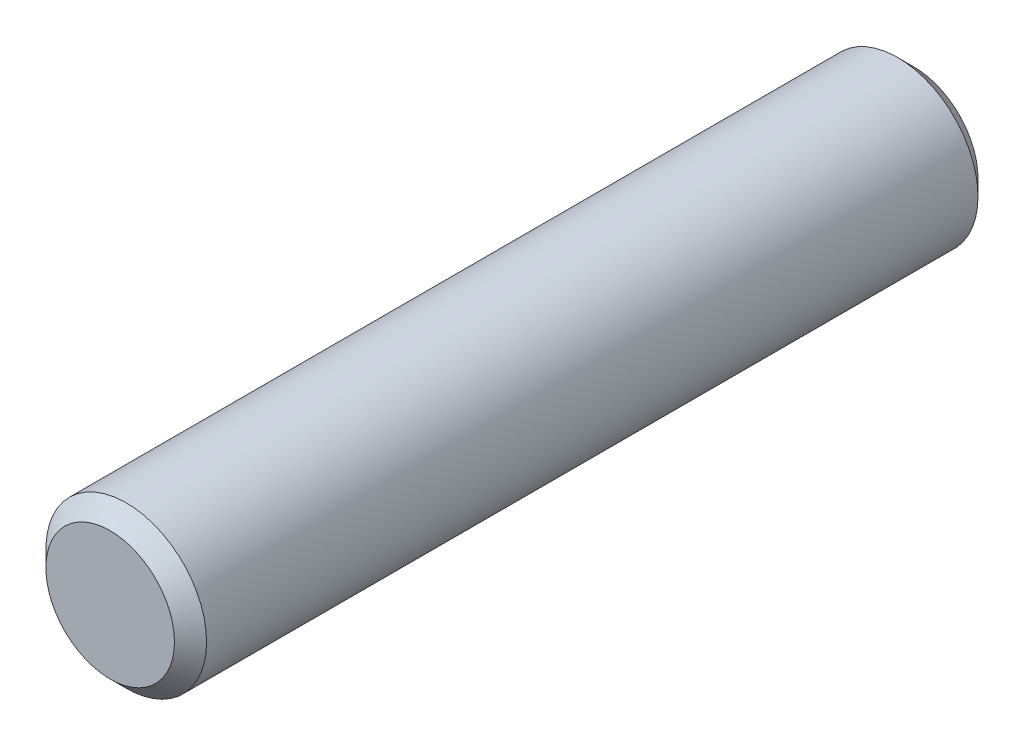
ISO-10303-21;
HEADER;
FILE_DESCRIPTION(('STEP AP214'),'2;1');
FILE_NAME('part.step','',(''),(''),'','','');
FILE_SCHEMA(('AUTOMOTIVE_DESIGN { 1 0 10303 214 1 1 1 1 }'));
ENDSEC;
DATA;
#1=APPLICATION_CONTEXT('core data for automotive mechanical design processes');
#2=APPLICATION_PROTOCOL_DEFINITION('international standard','automotive_design',2000,#1);
#3=PRODUCT_CONTEXT('',#1,'mechanical');
#4=PRODUCT('Part','Part','',(#3));
#5=PRODUCT_RELATED_PRODUCT_CATEGORY('part','',(#4));
#6=PRODUCT_DEFINITION_FORMATION('','',#4);
#7=PRODUCT_DEFINITION_CONTEXT('part definition',#1,'design');
#8=PRODUCT_DEFINITION('design','',#6,#7);
#9=PRODUCT_DEFINITION_SHAPE('','',#8);
#10=(LENGTH_UNIT() NAMED_UNIT(*) SI_UNIT(.MILLI.,.METRE.));
#11=(NAMED_UNIT(*) PLANE_ANGLE_UNIT() SI_UNIT($,.RADIAN.));
#12=(NAMED_UNIT(*) SI_UNIT($,.STERADIAN.) SOLID_ANGLE_UNIT());
#13=UNCERTAINTY_MEASURE_WITH_UNIT(LENGTH_MEASURE(1.E-05),#10,'distance_accuracy_value','');
#14=(GEOMETRIC_REPRESENTATION_CONTEXT(3) GLOBAL_UNCERTAINTY_ASSIGNED_CONTEXT((#13)) GLOBAL_UNIT_ASSIGNED_CONTEXT((#10,
#11,#12)) REPRESENTATION_CONTEXT('',''));
#15=CARTESIAN_POINT('',(0.,0.,0.));
#16=DIRECTION('',(0.,0.,1.));
#17=DIRECTION('',(1.,0.,0.));
#18=AXIS2_PLACEMENT_3D('',#15,#16,#17);
#19=CARTESIAN_POINT('',(0.,0.,-63.5));
#20=DIRECTION('',(0.,0.,1.));
#21=DIRECTION('',(1.,0.,0.));
#22=AXIS2_PLACEMENT_3D('',#19,#20,#21);
#23=CYLINDRICAL_SURFACE('',#22,6.35);
#24=CARTESIAN_POINT('',(0.,0.,-62.23));
#25=DIRECTION('',(0.,0.,1.));
#26=DIRECTION('',(1.,0.,0.));
#27=AXIS2_PLACEMENT_3D('',#24,#25,#26);
#28=CIRCLE('',#27,6.35);
#29=CARTESIAN_POINT('',(6.35,0.,-62.23));
#30=VERTEX_POINT('',#29);
#31=EDGE_CURVE('E43',#30,#30,#28,.T.);
#32=ORIENTED_EDGE('',*,*,#31,.T.);
#33=EDGE_LOOP('',(#32));
#34=FACE_BOUND('',#33,.T.);
#35=CARTESIAN_POINT('',(0.,0.,-1.27000000000001));
#36=DIRECTION('',(0.,0.,1.));
#37=DIRECTION('',(1.,0.,0.));
#38=AXIS2_PLACEMENT_3D('',#35,#36,#37);
#39=CIRCLE('',#38,6.35);
#40=CARTESIAN_POINT('',(6.35,0.,-1.27000000000001));
#41=VERTEX_POINT('',#40);
#42=EDGE_CURVE('E47',#41,#41,#39,.F.);
#43=ORIENTED_EDGE('',*,*,#42,.T.);
#44=EDGE_LOOP('',(#43));
#45=FACE_BOUND('',#44,.T.);
#46=ADVANCED_FACE('F32',(#34,#45),#23,.T.);
#47=CARTESIAN_POINT('',(0.,0.,-63.5));
#48=DIRECTION('',(0.,0.,1.));
#49=DIRECTION('',(1.,0.,0.));
#50=AXIS2_PLACEMENT_3D('',#47,#48,#49);
#51=PLANE('',#50);
#52=CARTESIAN_POINT('',(0.,0.,-63.5));
#53=DIRECTION('',(0.,0.,1.));
#54=DIRECTION('',(1.,0.,0.));
#55=AXIS2_PLACEMENT_3D('',#52,#53,#54);
#56=CIRCLE('',#55,5.07999999999999);
#57=CARTESIAN_POINT('',(5.07999999999999,0.,-63.5));
#58=VERTEX_POINT('',#57);
#59=EDGE_CURVE('E39',#58,#58,#56,.F.);
#60=ORIENTED_EDGE('',*,*,#59,.T.);
#61=EDGE_LOOP('',(#60));
#62=FACE_BOUND('',#61,.T.);
#63=ADVANCED_FACE('F63',(#62),#51,.F.);
#64=CARTESIAN_POINT('',(0.,0.,0.));
#65=DIRECTION('',(0.,0.,1.));
#66=DIRECTION('',(1.,0.,0.));
#67=AXIS2_PLACEMENT_3D('',#64,#65,#66);
#68=PLANE('',#67);
#69=CARTESIAN_POINT('',(0.,0.,0.));
#70=DIRECTION('',(0.,0.,1.));
#71=DIRECTION('',(1.,0.,0.));
#72=AXIS2_PLACEMENT_3D('',#69,#70,#71);
#73=CIRCLE('',#72,5.07999999999999);
#74=CARTESIAN_POINT('',(5.07999999999999,0.,0.));
#75=VERTEX_POINT('',#74);
#76=EDGE_CURVE('E10',#75,#75,#73,.T.);
#77=ORIENTED_EDGE('',*,*,#76,.T.);
#78=EDGE_LOOP('',(#77));
#79=FACE_BOUND('',#78,.T.);
#80=ADVANCED_FACE('F60',(#79),#68,.T.);
#81=CARTESIAN_POINT('',(0.,0.,-62.23));
#82=DIRECTION('',(0.,0.,1.));
#83=DIRECTION('',(1.,0.,0.));
#84=AXIS2_PLACEMENT_3D('',#81,#82,#83);
#85=CONICAL_SURFACE('',#84,6.35,0.785398163397448);
#86=ORIENTED_EDGE('',*,*,#59,.F.);
#87=EDGE_LOOP('',(#86));
#88=FACE_BOUND('',#87,.T.);
#89=ORIENTED_EDGE('',*,*,#31,.F.);
#90=EDGE_LOOP('',(#89));
#91=FACE_BOUND('',#90,.T.);
#92=ADVANCED_FACE('F56',(#88,#91),#85,.T.);
#93=CARTESIAN_POINT('',(0.,0.,0.));
#94=DIRECTION('',(0.,0.,-1.));
#95=DIRECTION('',(-1.,0.,0.));
#96=AXIS2_PLACEMENT_3D('',#93,#94,#95);
#97=CONICAL_SURFACE('',#96,5.07999999999999,0.785398163397445);
#98=ORIENTED_EDGE('',*,*,#42,.F.);
#99=EDGE_LOOP('',(#98));
#100=FACE_BOUND('',#99,.T.);
#101=ORIENTED_EDGE('',*,*,#76,.F.);
#102=EDGE_LOOP('',(#101));
#103=FACE_BOUND('',#102,.T.);
#104=ADVANCED_FACE('F34',(#100,#103),#97,.T.);
#105=CLOSED_SHELL('',(#46,#63,#80,#92,#104));
#106=MANIFOLD_SOLID_BREP('B2',#105);
#107=ADVANCED_BREP_SHAPE_REPRESENTATION('',(#18,#106),#14);
#108=SHAPE_DEFINITION_REPRESENTATION(#9,#107);
ENDSEC;
END-ISO-10303-21;
